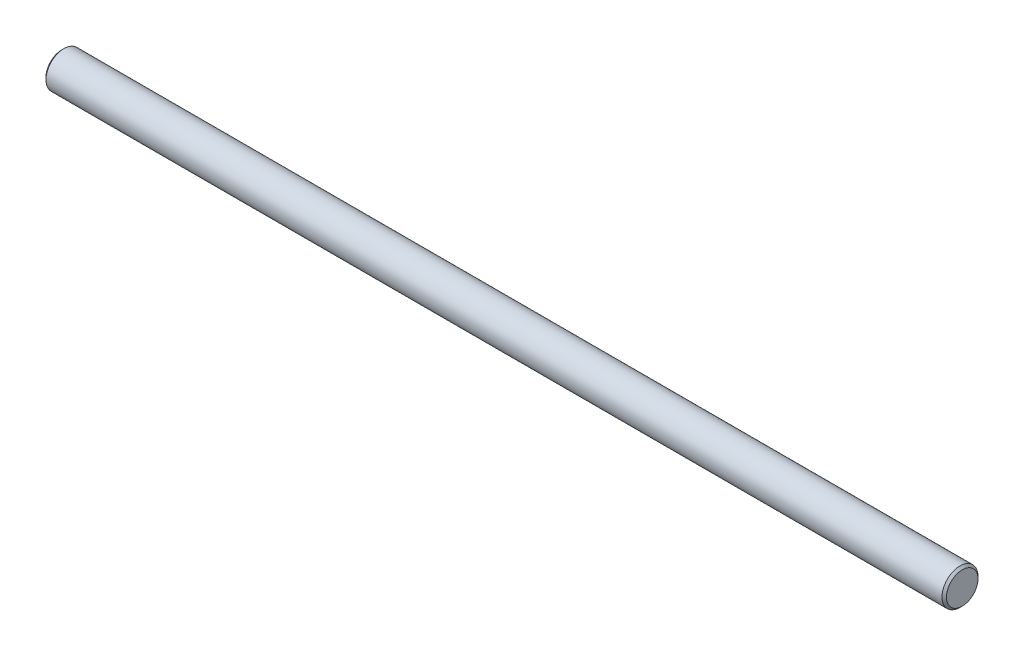
ISO-10303-21;
HEADER;
FILE_DESCRIPTION(('STEP AP214'),'2;1');
FILE_NAME('part.step','',(''),(''),'','','');
FILE_SCHEMA(('AUTOMOTIVE_DESIGN { 1 0 10303 214 1 1 1 1 }'));
ENDSEC;
DATA;
#1=APPLICATION_CONTEXT('core data for automotive mechanical design processes');
#2=APPLICATION_PROTOCOL_DEFINITION('international standard','automotive_design',2000,#1);
#3=PRODUCT_CONTEXT('',#1,'mechanical');
#4=PRODUCT('Part','Part','',(#3));
#5=PRODUCT_RELATED_PRODUCT_CATEGORY('part','',(#4));
#6=PRODUCT_DEFINITION_FORMATION('','',#4);
#7=PRODUCT_DEFINITION_CONTEXT('part definition',#1,'design');
#8=PRODUCT_DEFINITION('design','',#6,#7);
#9=PRODUCT_DEFINITION_SHAPE('','',#8);
#10=(LENGTH_UNIT() NAMED_UNIT(*) SI_UNIT(.MILLI.,.METRE.));
#11=(NAMED_UNIT(*) PLANE_ANGLE_UNIT() SI_UNIT($,.RADIAN.));
#12=(NAMED_UNIT(*) SI_UNIT($,.STERADIAN.) SOLID_ANGLE_UNIT());
#13=UNCERTAINTY_MEASURE_WITH_UNIT(LENGTH_MEASURE(1.E-05),#10,'distance_accuracy_value','');
#14=(GEOMETRIC_REPRESENTATION_CONTEXT(3) GLOBAL_UNCERTAINTY_ASSIGNED_CONTEXT((#13)) GLOBAL_UNIT_ASSIGNED_CONTEXT((#10,
#11,#12)) REPRESENTATION_CONTEXT('',''));
#15=CARTESIAN_POINT('',(0.,0.,0.));
#16=DIRECTION('',(0.,0.,1.));
#17=DIRECTION('',(1.,0.,0.));
#18=AXIS2_PLACEMENT_3D('',#15,#16,#17);
#19=CARTESIAN_POINT('',(200.,0.,0.));
#20=DIRECTION('',(-1.,0.,0.));
#21=DIRECTION('',(0.,0.,1.));
#22=AXIS2_PLACEMENT_3D('',#19,#20,#21);
#23=CYLINDRICAL_SURFACE('',#22,4.);
#24=CARTESIAN_POINT('',(199.5,0.,0.));
#25=DIRECTION('',(1.,0.,0.));
#26=DIRECTION('',(0.,0.,-1.));
#27=AXIS2_PLACEMENT_3D('',#24,#25,#26);
#28=CIRCLE('',#27,4.);
#29=CARTESIAN_POINT('',(199.5,0.,-4.));
#30=VERTEX_POINT('',#29);
#31=EDGE_CURVE('E48',#30,#30,#28,.F.);
#32=ORIENTED_EDGE('',*,*,#31,.T.);
#33=EDGE_LOOP('',(#32));
#34=FACE_BOUND('',#33,.T.);
#35=CARTESIAN_POINT('',(0.5,0.,0.));
#36=DIRECTION('',(1.,0.,0.));
#37=DIRECTION('',(0.,0.,-1.));
#38=AXIS2_PLACEMENT_3D('',#35,#36,#37);
#39=CIRCLE('',#38,4.);
#40=CARTESIAN_POINT('',(0.5,0.,-4.));
#41=VERTEX_POINT('',#40);
#42=EDGE_CURVE('E53',#41,#41,#39,.T.);
#43=ORIENTED_EDGE('',*,*,#42,.T.);
#44=EDGE_LOOP('',(#43));
#45=FACE_BOUND('',#44,.T.);
#46=ADVANCED_FACE('F39',(#34,#45),#23,.T.);
#47=CARTESIAN_POINT('',(200.,0.,0.));
#48=DIRECTION('',(1.,0.,0.));
#49=DIRECTION('',(0.,0.,-1.));
#50=AXIS2_PLACEMENT_3D('',#47,#48,#49);
#51=PLANE('',#50);
#52=CARTESIAN_POINT('',(200.,0.,0.));
#53=DIRECTION('',(1.,0.,0.));
#54=DIRECTION('',(0.,0.,-1.));
#55=AXIS2_PLACEMENT_3D('',#52,#53,#54);
#56=CIRCLE('',#55,3.5);
#57=CARTESIAN_POINT('',(200.,0.,-3.5));
#58=VERTEX_POINT('',#57);
#59=EDGE_CURVE('E58',#58,#58,#56,.T.);
#60=ORIENTED_EDGE('',*,*,#59,.T.);
#61=EDGE_LOOP('',(#60));
#62=FACE_BOUND('',#61,.T.);
#63=ADVANCED_FACE('F65',(#62),#51,.T.);
#64=CARTESIAN_POINT('',(0.,0.,0.));
#65=DIRECTION('',(1.,0.,0.));
#66=DIRECTION('',(0.,0.,-1.));
#67=AXIS2_PLACEMENT_3D('',#64,#65,#66);
#68=PLANE('',#67);
#69=CARTESIAN_POINT('',(0.,0.,0.));
#70=DIRECTION('',(1.,0.,0.));
#71=DIRECTION('',(0.,0.,-1.));
#72=AXIS2_PLACEMENT_3D('',#69,#70,#71);
#73=CIRCLE('',#72,3.49999999999998);
#74=CARTESIAN_POINT('',(0.,0.,-3.49999999999998));
#75=VERTEX_POINT('',#74);
#76=EDGE_CURVE('E10',#75,#75,#73,.F.);
#77=ORIENTED_EDGE('',*,*,#76,.T.);
#78=EDGE_LOOP('',(#77));
#79=FACE_BOUND('',#78,.T.);
#80=ADVANCED_FACE('F69',(#79),#68,.F.);
#81=CARTESIAN_POINT('',(200.,0.,0.));
#82=DIRECTION('',(-1.,0.,0.));
#83=DIRECTION('',(0.,0.,1.));
#84=AXIS2_PLACEMENT_3D('',#81,#82,#83);
#85=CONICAL_SURFACE('',#84,3.5,0.785398163397473);
#86=ORIENTED_EDGE('',*,*,#31,.F.);
#87=EDGE_LOOP('',(#86));
#88=FACE_BOUND('',#87,.T.);
#89=ORIENTED_EDGE('',*,*,#59,.F.);
#90=EDGE_LOOP('',(#89));
#91=FACE_BOUND('',#90,.T.);
#92=ADVANCED_FACE('F67',(#88,#91),#85,.T.);
#93=CARTESIAN_POINT('',(0.5,0.,0.));
#94=DIRECTION('',(1.,0.,0.));
#95=DIRECTION('',(0.,0.,-1.));
#96=AXIS2_PLACEMENT_3D('',#93,#94,#95);
#97=CONICAL_SURFACE('',#96,4.,0.785398163397473);
#98=ORIENTED_EDGE('',*,*,#76,.F.);
#99=EDGE_LOOP('',(#98));
#100=FACE_BOUND('',#99,.T.);
#101=ORIENTED_EDGE('',*,*,#42,.F.);
#102=EDGE_LOOP('',(#101));
#103=FACE_BOUND('',#102,.T.);
#104=ADVANCED_FACE('F42',(#100,#103),#97,.T.);
#105=CLOSED_SHELL('',(#46,#63,#80,#92,#104));
#106=MANIFOLD_SOLID_BREP('B2',#105);
#107=ADVANCED_BREP_SHAPE_REPRESENTATION('',(#18,#106),#14);
#108=SHAPE_DEFINITION_REPRESENTATION(#9,#107);
ENDSEC;
END-ISO-10303-21;
